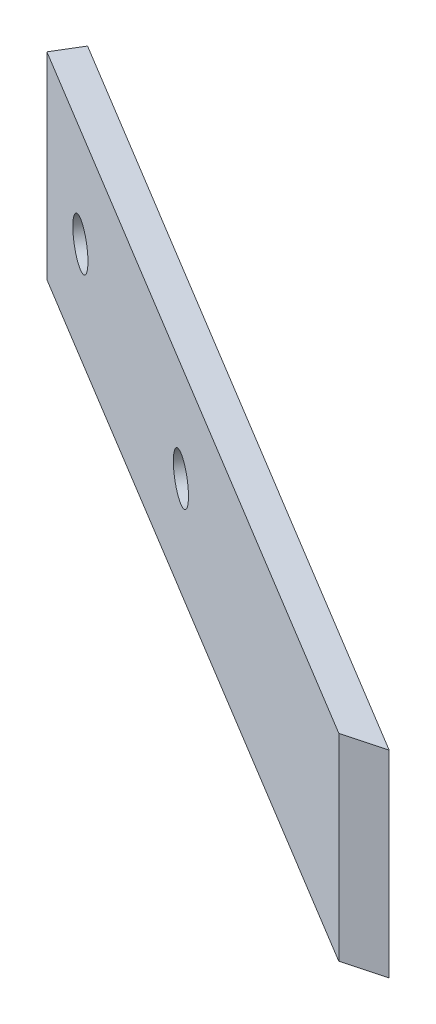
ISO-10303-21;
HEADER;
FILE_DESCRIPTION(('STEP AP214'),'2;1');
FILE_NAME('part.step','',(''),(''),'','','');
FILE_SCHEMA(('AUTOMOTIVE_DESIGN { 1 0 10303 214 1 1 1 1 }'));
ENDSEC;
DATA;
#1=APPLICATION_CONTEXT('core data for automotive mechanical design processes');
#2=APPLICATION_PROTOCOL_DEFINITION('international standard','automotive_design',2000,#1);
#3=PRODUCT_CONTEXT('',#1,'mechanical');
#4=PRODUCT('Part','Part','',(#3));
#5=PRODUCT_RELATED_PRODUCT_CATEGORY('part','',(#4));
#6=PRODUCT_DEFINITION_FORMATION('','',#4);
#7=PRODUCT_DEFINITION_CONTEXT('part definition',#1,'design');
#8=PRODUCT_DEFINITION('design','',#6,#7);
#9=PRODUCT_DEFINITION_SHAPE('','',#8);
#10=(LENGTH_UNIT() NAMED_UNIT(*) SI_UNIT(.MILLI.,.METRE.));
#11=(NAMED_UNIT(*) PLANE_ANGLE_UNIT() SI_UNIT($,.RADIAN.));
#12=(NAMED_UNIT(*) SI_UNIT($,.STERADIAN.) SOLID_ANGLE_UNIT());
#13=UNCERTAINTY_MEASURE_WITH_UNIT(LENGTH_MEASURE(1.E-05),#10,'distance_accuracy_value','');
#14=(GEOMETRIC_REPRESENTATION_CONTEXT(3) GLOBAL_UNCERTAINTY_ASSIGNED_CONTEXT((#13)) GLOBAL_UNIT_ASSIGNED_CONTEXT((#10,
#11,#12)) REPRESENTATION_CONTEXT('',''));
#15=CARTESIAN_POINT('',(0.,0.,0.));
#16=DIRECTION('',(0.,0.,1.));
#17=DIRECTION('',(1.,0.,0.));
#18=AXIS2_PLACEMENT_3D('',#15,#16,#17);
#19=CARTESIAN_POINT('',(-833.4991816804,-1721.,2957.70691297));
#20=DIRECTION('',(0.516684488886123,0.,-0.856175880847204));
#21=DIRECTION('',(0.856175880847204,0.,0.516684488886123));
#22=AXIS2_PLACEMENT_3D('',#19,#20,#21);
#23=CYLINDRICAL_SURFACE('',#22,4.5);
#24=CARTESIAN_POINT('',(-835.6175880849,-1721.,2961.217234082));
#25=DIRECTION('',(0.516684488886123,0.,-0.856175880847204));
#26=DIRECTION('',(0.856175880847204,0.,0.516684488886123));
#27=AXIS2_PLACEMENT_3D('',#24,#25,#26);
#28=CIRCLE('',#27,4.5);
#29=CARTESIAN_POINT('',(-831.764796621,-1721.,2963.542314282));
#30=VERTEX_POINT('',#29);
#31=EDGE_CURVE('E97',#30,#30,#28,.T.);
#32=ORIENTED_EDGE('',*,*,#31,.T.);
#33=DIRECTION('',(-0.516684488886123,0.,0.856175880847204));
#34=VECTOR('',#33,1.);
#35=CARTESIAN_POINT('',(-829.6463902165,-1721.,2960.03199317));
#36=LINE('',#35,#34);
#37=CARTESIAN_POINT('',(-834.8649035543,-1721.,2968.679369567));
#38=VERTEX_POINT('',#37);
#39=EDGE_CURVE('E11',#30,#38,#36,.T.);
#40=ORIENTED_EDGE('',*,*,#39,.T.);
#41=CARTESIAN_POINT('',(-838.7176950182,-1721.,2966.354289367));
#42=DIRECTION('',(0.516684488886123,0.,-0.856175880847204));
#43=DIRECTION('',(0.856175880847204,0.,0.516684488886123));
#44=AXIS2_PLACEMENT_3D('',#41,#42,#43);
#45=CIRCLE('',#44,4.5);
#46=EDGE_CURVE('E89',#38,#38,#45,.T.);
#47=ORIENTED_EDGE('',*,*,#46,.F.);
#48=ORIENTED_EDGE('',*,*,#39,.F.);
#49=EDGE_LOOP('',(#32,#40,#47,#48));
#50=FACE_BOUND('',#49,.T.);
#51=ADVANCED_FACE('F17',(#50),#23,.F.);
#52=CARTESIAN_POINT('',(-884.8697345312,-1721.,2926.705843637));
#53=DIRECTION('',(0.516684488886123,0.,-0.856175880847204));
#54=DIRECTION('',(0.856175880847204,0.,0.516684488886123));
#55=AXIS2_PLACEMENT_3D('',#52,#53,#54);
#56=CYLINDRICAL_SURFACE('',#55,4.5);
#57=CARTESIAN_POINT('',(-886.9881409357,-1721.,2930.216164749));
#58=DIRECTION('',(0.516684488886123,0.,-0.856175880847204));
#59=DIRECTION('',(0.856175880847204,0.,0.516684488886123));
#60=AXIS2_PLACEMENT_3D('',#57,#58,#59);
#61=CIRCLE('',#60,4.5);
#62=CARTESIAN_POINT('',(-883.1353494719,-1721.,2932.541244949));
#63=VERTEX_POINT('',#62);
#64=EDGE_CURVE('E86',#63,#63,#61,.T.);
#65=ORIENTED_EDGE('',*,*,#64,.T.);
#66=DIRECTION('',(-0.516684488886123,0.,0.856175880847204));
#67=VECTOR('',#66,1.);
#68=CARTESIAN_POINT('',(-881.0169430674,-1721.,2929.030923837));
#69=LINE('',#68,#67);
#70=CARTESIAN_POINT('',(-886.2354564052,-1721.,2937.678300234));
#71=VERTEX_POINT('',#70);
#72=EDGE_CURVE('E25',#63,#71,#69,.T.);
#73=ORIENTED_EDGE('',*,*,#72,.T.);
#74=CARTESIAN_POINT('',(-890.088247869,-1721.,2935.353220034));
#75=DIRECTION('',(0.516684488886123,0.,-0.856175880847204));
#76=DIRECTION('',(0.856175880847204,0.,0.516684488886123));
#77=AXIS2_PLACEMENT_3D('',#74,#75,#76);
#78=CIRCLE('',#77,4.5);
#79=EDGE_CURVE('E87',#71,#71,#78,.T.);
#80=ORIENTED_EDGE('',*,*,#79,.F.);
#81=ORIENTED_EDGE('',*,*,#72,.F.);
#82=EDGE_LOOP('',(#65,#73,#80,#81));
#83=FACE_BOUND('',#82,.T.);
#84=ADVANCED_FACE('F84',(#83),#56,.F.);
#85=CARTESIAN_POINT('',(-46.32860907335,0.,2824.337502034));
#86=DIRECTION('',(-0.258819045102985,0.,-0.965925826288944));
#87=DIRECTION('',(-0.965925826288944,0.,0.258819045102985));
#88=AXIS2_PLACEMENT_3D('',#85,#86,#87);
#89=PLANE('',#88);
#90=DIRECTION('',(0.,-1.,0.));
#91=VECTOR('',#90,1.);
#92=CARTESIAN_POINT('',(-758.0418592203,-870.5,3015.040492654));
#93=LINE('',#92,#91);
#94=CARTESIAN_POINT('',(-758.0418592203,-1701.,3015.040492654));
#95=VERTEX_POINT('',#94);
#96=CARTESIAN_POINT('',(-758.0418592203,-1741.,3015.040492654));
#97=VERTEX_POINT('',#96);
#98=EDGE_CURVE('E96',#95,#97,#93,.T.);
#99=ORIENTED_EDGE('',*,*,#98,.T.);
#100=DIRECTION('',(-0.965925826288944,0.,0.258819045102985));
#101=VECTOR('',#100,1.);
#102=CARTESIAN_POINT('',(-458.4329710063,-1741.,2934.760533012));
#103=LINE('',#102,#101);
#104=CARTESIAN_POINT('',(-750.,-1741.,3012.88568297));
#105=VERTEX_POINT('',#104);
#106=EDGE_CURVE('E111',#105,#97,#103,.T.);
#107=ORIENTED_EDGE('',*,*,#106,.F.);
#108=DIRECTION('',(0.,1.,0.));
#109=VECTOR('',#108,1.);
#110=CARTESIAN_POINT('',(-750.,-1741.,3012.88568297));
#111=LINE('',#110,#109);
#112=CARTESIAN_POINT('',(-750.,-1701.,3012.88568297));
#113=VERTEX_POINT('',#112);
#114=EDGE_CURVE('E103',#105,#113,#111,.T.);
#115=ORIENTED_EDGE('',*,*,#114,.T.);
#116=DIRECTION('',(-0.965925826288944,0.,0.258819045102985));
#117=VECTOR('',#116,1.);
#118=CARTESIAN_POINT('',(-458.4329710063,-1701.,2934.760533012));
#119=LINE('',#118,#117);
#120=EDGE_CURVE('E100',#113,#95,#119,.T.);
#121=ORIENTED_EDGE('',*,*,#120,.T.);
#122=EDGE_LOOP('',(#99,#107,#115,#121));
#123=FACE_BOUND('',#122,.T.);
#124=ADVANCED_FACE('F164',(#123),#89,.F.);
#125=CARTESIAN_POINT('',(-907.2117654858,-1741.,2925.019530256));
#126=DIRECTION('',(-0.516684488886123,0.,0.856175880847204));
#127=DIRECTION('',(0.,1.,0.));
#128=AXIS2_PLACEMENT_3D('',#125,#126,#127);
#129=PLANE('',#128);
#130=ORIENTED_EDGE('',*,*,#46,.T.);
#131=EDGE_LOOP('',(#130));
#132=FACE_BOUND('',#131,.T.);
#133=ORIENTED_EDGE('',*,*,#79,.T.);
#134=EDGE_LOOP('',(#133));
#135=FACE_BOUND('',#134,.T.);
#136=DIRECTION('',(0.856175880847204,0.,0.516684488886123));
#137=VECTOR('',#136,1.);
#138=CARTESIAN_POINT('',(-907.2117654858,-1701.,2925.019530256));
#139=LINE('',#138,#137);
#140=CARTESIAN_POINT('',(-907.2117654858,-1701.,2925.019530256));
#141=VERTEX_POINT('',#140);
#142=EDGE_CURVE('E114',#141,#95,#139,.T.);
#143=ORIENTED_EDGE('',*,*,#142,.F.);
#144=DIRECTION('',(0.,1.,0.));
#145=VECTOR('',#144,1.);
#146=CARTESIAN_POINT('',(-907.2117654858,-1741.,2925.019530256));
#147=LINE('',#146,#145);
#148=CARTESIAN_POINT('',(-907.2117654858,-1741.,2925.019530256));
#149=VERTEX_POINT('',#148);
#150=EDGE_CURVE('E144',#149,#141,#147,.T.);
#151=ORIENTED_EDGE('',*,*,#150,.F.);
#152=DIRECTION('',(0.856175880847204,0.,0.516684488886123));
#153=VECTOR('',#152,1.);
#154=CARTESIAN_POINT('',(-907.2117654858,-1741.,2925.019530256));
#155=LINE('',#154,#153);
#156=EDGE_CURVE('E119',#149,#97,#155,.T.);
#157=ORIENTED_EDGE('',*,*,#156,.T.);
#158=ORIENTED_EDGE('',*,*,#98,.F.);
#159=EDGE_LOOP('',(#143,#151,#157,#158));
#160=FACE_BOUND('',#159,.T.);
#161=ADVANCED_FACE('F155',(#132,#135,#160),#129,.T.);
#162=CARTESIAN_POINT('',(-904.1116585524,-1701.,2919.882474971));
#163=DIRECTION('',(0.,1.,0.));
#164=DIRECTION('',(1.,0.,0.));
#165=AXIS2_PLACEMENT_3D('',#162,#163,#164);
#166=PLANE('',#165);
#167=ORIENTED_EDGE('',*,*,#120,.F.);
#168=DIRECTION('',(0.856175880847204,0.,0.516684488886123));
#169=VECTOR('',#168,1.);
#170=CARTESIAN_POINT('',(-904.1116585524,-1701.,2919.882474971));
#171=LINE('',#170,#169);
#172=CARTESIAN_POINT('',(-904.1116585524,-1701.,2919.882474971));
#173=VERTEX_POINT('',#172);
#174=EDGE_CURVE('E107',#173,#113,#171,.T.);
#175=ORIENTED_EDGE('',*,*,#174,.F.);
#176=DIRECTION('',(-0.516684488886123,0.,0.856175880847204));
#177=VECTOR('',#176,1.);
#178=CARTESIAN_POINT('',(-904.1116585524,-1701.,2919.882474971));
#179=LINE('',#178,#177);
#180=EDGE_CURVE('E137',#173,#141,#179,.T.);
#181=ORIENTED_EDGE('',*,*,#180,.T.);
#182=ORIENTED_EDGE('',*,*,#142,.T.);
#183=EDGE_LOOP('',(#167,#175,#181,#182));
#184=FACE_BOUND('',#183,.T.);
#185=ADVANCED_FACE('F157',(#184),#166,.T.);
#186=CARTESIAN_POINT('',(-904.1116585524,-1741.,2919.882474971));
#187=DIRECTION('',(-0.516684488886123,0.,0.856175880847204));
#188=DIRECTION('',(0.,1.,0.));
#189=AXIS2_PLACEMENT_3D('',#186,#187,#188);
#190=PLANE('',#189);
#191=ORIENTED_EDGE('',*,*,#31,.F.);
#192=EDGE_LOOP('',(#191));
#193=FACE_BOUND('',#192,.T.);
#194=ORIENTED_EDGE('',*,*,#64,.F.);
#195=EDGE_LOOP('',(#194));
#196=FACE_BOUND('',#195,.T.);
#197=ORIENTED_EDGE('',*,*,#174,.T.);
#198=ORIENTED_EDGE('',*,*,#114,.F.);
#199=DIRECTION('',(0.856175880847204,0.,0.516684488886123));
#200=VECTOR('',#199,1.);
#201=CARTESIAN_POINT('',(-904.1116585524,-1741.,2919.882474971));
#202=LINE('',#201,#200);
#203=CARTESIAN_POINT('',(-904.1116585524,-1741.,2919.882474971));
#204=VERTEX_POINT('',#203);
#205=EDGE_CURVE('E118',#204,#105,#202,.T.);
#206=ORIENTED_EDGE('',*,*,#205,.F.);
#207=DIRECTION('',(0.,1.,0.));
#208=VECTOR('',#207,1.);
#209=CARTESIAN_POINT('',(-904.1116585524,-1741.,2919.882474971));
#210=LINE('',#209,#208);
#211=EDGE_CURVE('E130',#204,#173,#210,.T.);
#212=ORIENTED_EDGE('',*,*,#211,.T.);
#213=EDGE_LOOP('',(#197,#198,#206,#212));
#214=FACE_BOUND('',#213,.T.);
#215=ADVANCED_FACE('F159',(#193,#196,#214),#190,.F.);
#216=CARTESIAN_POINT('',(-904.1116585524,-1741.,2919.882474971));
#217=DIRECTION('',(0.,1.,0.));
#218=DIRECTION('',(1.,0.,0.));
#219=AXIS2_PLACEMENT_3D('',#216,#217,#218);
#220=PLANE('',#219);
#221=ORIENTED_EDGE('',*,*,#156,.F.);
#222=DIRECTION('',(-0.516684488886123,0.,0.856175880847204));
#223=VECTOR('',#222,1.);
#224=CARTESIAN_POINT('',(-904.1116585524,-1741.,2919.882474971));
#225=LINE('',#224,#223);
#226=EDGE_CURVE('E123',#204,#149,#225,.T.);
#227=ORIENTED_EDGE('',*,*,#226,.F.);
#228=ORIENTED_EDGE('',*,*,#205,.T.);
#229=ORIENTED_EDGE('',*,*,#106,.T.);
#230=EDGE_LOOP('',(#221,#227,#228,#229));
#231=FACE_BOUND('',#230,.T.);
#232=ADVANCED_FACE('F162',(#231),#220,.F.);
#233=CARTESIAN_POINT('',(-904.1116585524,-1741.,2919.882474971));
#234=DIRECTION('',(0.856175880847204,0.,0.516684488886123));
#235=DIRECTION('',(0.,-1.,0.));
#236=AXIS2_PLACEMENT_3D('',#233,#234,#235);
#237=PLANE('',#236);
#238=ORIENTED_EDGE('',*,*,#150,.T.);
#239=ORIENTED_EDGE('',*,*,#180,.F.);
#240=ORIENTED_EDGE('',*,*,#211,.F.);
#241=ORIENTED_EDGE('',*,*,#226,.T.);
#242=EDGE_LOOP('',(#238,#239,#240,#241));
#243=FACE_BOUND('',#242,.T.);
#244=ADVANCED_FACE('F151',(#243),#237,.F.);
#245=CLOSED_SHELL('',(#51,#84,#124,#161,#185,#215,#232,#244));
#246=MANIFOLD_SOLID_BREP('B1',#245);
#247=ADVANCED_BREP_SHAPE_REPRESENTATION('',(#18,#246),#14);
#248=SHAPE_DEFINITION_REPRESENTATION(#9,#247);
ENDSEC;
END-ISO-10303-21;
